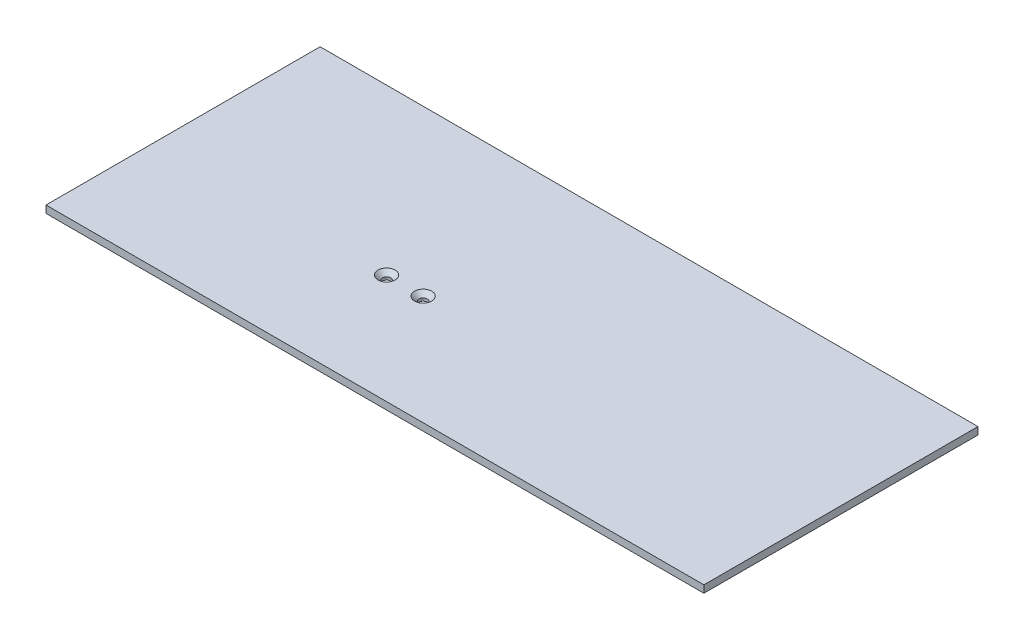
ISO-10303-21;
HEADER;
FILE_DESCRIPTION(('STEP AP214'),'2;1');
FILE_NAME('part.step','',(''),(''),'','','');
FILE_SCHEMA(('AUTOMOTIVE_DESIGN { 1 0 10303 214 1 1 1 1 }'));
ENDSEC;
DATA;
#1=APPLICATION_CONTEXT('core data for automotive mechanical design processes');
#2=APPLICATION_PROTOCOL_DEFINITION('international standard','automotive_design',2000,#1);
#3=PRODUCT_CONTEXT('',#1,'mechanical');
#4=PRODUCT('Part','Part','',(#3));
#5=PRODUCT_RELATED_PRODUCT_CATEGORY('part','',(#4));
#6=PRODUCT_DEFINITION_FORMATION('','',#4);
#7=PRODUCT_DEFINITION_CONTEXT('part definition',#1,'design');
#8=PRODUCT_DEFINITION('design','',#6,#7);
#9=PRODUCT_DEFINITION_SHAPE('','',#8);
#10=(LENGTH_UNIT() NAMED_UNIT(*) SI_UNIT(.MILLI.,.METRE.));
#11=(NAMED_UNIT(*) PLANE_ANGLE_UNIT() SI_UNIT($,.RADIAN.));
#12=(NAMED_UNIT(*) SI_UNIT($,.STERADIAN.) SOLID_ANGLE_UNIT());
#13=UNCERTAINTY_MEASURE_WITH_UNIT(LENGTH_MEASURE(1.E-05),#10,'distance_accuracy_value','');
#14=(GEOMETRIC_REPRESENTATION_CONTEXT(3) GLOBAL_UNCERTAINTY_ASSIGNED_CONTEXT((#13)) GLOBAL_UNIT_ASSIGNED_CONTEXT((#10,
#11,#12)) REPRESENTATION_CONTEXT('',''));
#15=CARTESIAN_POINT('',(0.,0.,0.));
#16=DIRECTION('',(0.,0.,1.));
#17=DIRECTION('',(1.,0.,0.));
#18=AXIS2_PLACEMENT_3D('',#15,#16,#17);
#19=CARTESIAN_POINT('',(-180.,4.,-105.));
#20=DIRECTION('',(0.,0.,1.));
#21=DIRECTION('',(1.,0.,0.));
#22=AXIS2_PLACEMENT_3D('',#19,#20,#21);
#23=PLANE('',#22);
#24=DIRECTION('',(-1.,0.,0.));
#25=VECTOR('',#24,1.);
#26=CARTESIAN_POINT('',(-180.,0.,-105.));
#27=LINE('',#26,#25);
#28=CARTESIAN_POINT('',(180.,0.,-105.));
#29=VERTEX_POINT('',#28);
#30=CARTESIAN_POINT('',(-180.,0.,-105.));
#31=VERTEX_POINT('',#30);
#32=EDGE_CURVE('E88',#29,#31,#27,.T.);
#33=ORIENTED_EDGE('',*,*,#32,.T.);
#34=DIRECTION('',(0.,-1.,0.));
#35=VECTOR('',#34,1.);
#36=CARTESIAN_POINT('',(-180.,4.,-105.));
#37=LINE('',#36,#35);
#38=CARTESIAN_POINT('',(-180.,4.,-105.));
#39=VERTEX_POINT('',#38);
#40=EDGE_CURVE('E42',#39,#31,#37,.T.);
#41=ORIENTED_EDGE('',*,*,#40,.F.);
#42=DIRECTION('',(-1.,0.,0.));
#43=VECTOR('',#42,1.);
#44=CARTESIAN_POINT('',(-180.,4.,-105.));
#45=LINE('',#44,#43);
#46=CARTESIAN_POINT('',(180.,4.,-105.));
#47=VERTEX_POINT('',#46);
#48=EDGE_CURVE('E80',#47,#39,#45,.T.);
#49=ORIENTED_EDGE('',*,*,#48,.F.);
#50=DIRECTION('',(0.,-1.,0.));
#51=VECTOR('',#50,1.);
#52=CARTESIAN_POINT('',(180.,4.,-105.));
#53=LINE('',#52,#51);
#54=EDGE_CURVE('E11',#47,#29,#53,.T.);
#55=ORIENTED_EDGE('',*,*,#54,.T.);
#56=EDGE_LOOP('',(#33,#41,#49,#55));
#57=FACE_BOUND('',#56,.T.);
#58=ADVANCED_FACE('F34',(#57),#23,.F.);
#59=CARTESIAN_POINT('',(-180.,4.,45.));
#60=DIRECTION('',(1.,0.,0.));
#61=DIRECTION('',(0.,0.,-1.));
#62=AXIS2_PLACEMENT_3D('',#59,#60,#61);
#63=PLANE('',#62);
#64=DIRECTION('',(0.,0.,1.));
#65=VECTOR('',#64,1.);
#66=CARTESIAN_POINT('',(-180.,0.,45.));
#67=LINE('',#66,#65);
#68=CARTESIAN_POINT('',(-180.,0.,45.));
#69=VERTEX_POINT('',#68);
#70=EDGE_CURVE('E67',#31,#69,#67,.T.);
#71=ORIENTED_EDGE('',*,*,#70,.T.);
#72=DIRECTION('',(0.,-1.,0.));
#73=VECTOR('',#72,1.);
#74=CARTESIAN_POINT('',(-180.,4.,45.));
#75=LINE('',#74,#73);
#76=CARTESIAN_POINT('',(-180.,4.,45.));
#77=VERTEX_POINT('',#76);
#78=EDGE_CURVE('E89',#77,#69,#75,.T.);
#79=ORIENTED_EDGE('',*,*,#78,.F.);
#80=DIRECTION('',(0.,0.,1.));
#81=VECTOR('',#80,1.);
#82=CARTESIAN_POINT('',(-180.,4.,-45.));
#83=LINE('',#82,#81);
#84=EDGE_CURVE('E84',#39,#77,#83,.T.);
#85=ORIENTED_EDGE('',*,*,#84,.F.);
#86=ORIENTED_EDGE('',*,*,#40,.T.);
#87=EDGE_LOOP('',(#71,#79,#85,#86));
#88=FACE_BOUND('',#87,.T.);
#89=ADVANCED_FACE('F90',(#88),#63,.F.);
#90=CARTESIAN_POINT('',(-180.,4.,45.));
#91=DIRECTION('',(0.,0.,-1.));
#92=DIRECTION('',(-1.,0.,0.));
#93=AXIS2_PLACEMENT_3D('',#90,#91,#92);
#94=PLANE('',#93);
#95=DIRECTION('',(1.,0.,0.));
#96=VECTOR('',#95,1.);
#97=CARTESIAN_POINT('',(-180.,0.,45.));
#98=LINE('',#97,#96);
#99=CARTESIAN_POINT('',(180.,0.,45.));
#100=VERTEX_POINT('',#99);
#101=EDGE_CURVE('E74',#69,#100,#98,.T.);
#102=ORIENTED_EDGE('',*,*,#101,.T.);
#103=DIRECTION('',(0.,-1.,0.));
#104=VECTOR('',#103,1.);
#105=CARTESIAN_POINT('',(180.,4.,45.));
#106=LINE('',#105,#104);
#107=CARTESIAN_POINT('',(180.,4.,45.));
#108=VERTEX_POINT('',#107);
#109=EDGE_CURVE('E94',#108,#100,#106,.T.);
#110=ORIENTED_EDGE('',*,*,#109,.F.);
#111=DIRECTION('',(1.,0.,0.));
#112=VECTOR('',#111,1.);
#113=CARTESIAN_POINT('',(-180.,4.,45.));
#114=LINE('',#113,#112);
#115=EDGE_CURVE('E92',#77,#108,#114,.T.);
#116=ORIENTED_EDGE('',*,*,#115,.F.);
#117=ORIENTED_EDGE('',*,*,#78,.T.);
#118=EDGE_LOOP('',(#102,#110,#116,#117));
#119=FACE_BOUND('',#118,.T.);
#120=ADVANCED_FACE('F105',(#119),#94,.F.);
#121=CARTESIAN_POINT('',(180.,4.,45.));
#122=DIRECTION('',(-1.,0.,0.));
#123=DIRECTION('',(0.,0.,1.));
#124=AXIS2_PLACEMENT_3D('',#121,#122,#123);
#125=PLANE('',#124);
#126=DIRECTION('',(0.,0.,-1.));
#127=VECTOR('',#126,1.);
#128=CARTESIAN_POINT('',(180.,0.,45.));
#129=LINE('',#128,#127);
#130=EDGE_CURVE('E102',#100,#29,#129,.T.);
#131=ORIENTED_EDGE('',*,*,#130,.T.);
#132=ORIENTED_EDGE('',*,*,#54,.F.);
#133=DIRECTION('',(0.,0.,-1.));
#134=VECTOR('',#133,1.);
#135=CARTESIAN_POINT('',(180.,4.,-45.));
#136=LINE('',#135,#134);
#137=EDGE_CURVE('E50',#108,#47,#136,.T.);
#138=ORIENTED_EDGE('',*,*,#137,.F.);
#139=ORIENTED_EDGE('',*,*,#109,.T.);
#140=EDGE_LOOP('',(#131,#132,#138,#139));
#141=FACE_BOUND('',#140,.T.);
#142=ADVANCED_FACE('F109',(#141),#125,.F.);
#143=CARTESIAN_POINT('',(0.,4.,0.));
#144=DIRECTION('',(0.,-1.,0.));
#145=DIRECTION('',(0.,0.,-1.));
#146=AXIS2_PLACEMENT_3D('',#143,#144,#145);
#147=PLANE('',#146);
#148=CARTESIAN_POINT('',(-53.634798041379,4.,-15.));
#149=DIRECTION('',(0.,1.,0.));
#150=DIRECTION('',(0.,0.,1.));
#151=AXIS2_PLACEMENT_3D('',#148,#149,#150);
#152=CIRCLE('',#151,4.7);
#153=CARTESIAN_POINT('',(-53.634798041379,4.,-10.3));
#154=VERTEX_POINT('',#153);
#155=EDGE_CURVE('E199',#154,#154,#152,.T.);
#156=ORIENTED_EDGE('',*,*,#155,.F.);
#157=EDGE_LOOP('',(#156));
#158=FACE_BOUND('',#157,.T.);
#159=CARTESIAN_POINT('',(-33.634798041379,4.,-15.));
#160=DIRECTION('',(0.,1.,0.));
#161=DIRECTION('',(0.,0.,1.));
#162=AXIS2_PLACEMENT_3D('',#159,#160,#161);
#163=CIRCLE('',#162,4.7);
#164=CARTESIAN_POINT('',(-33.634798041379,4.,-10.3));
#165=VERTEX_POINT('',#164);
#166=EDGE_CURVE('E206',#165,#165,#163,.T.);
#167=ORIENTED_EDGE('',*,*,#166,.F.);
#168=EDGE_LOOP('',(#167));
#169=FACE_BOUND('',#168,.T.);
#170=ORIENTED_EDGE('',*,*,#137,.T.);
#171=ORIENTED_EDGE('',*,*,#48,.T.);
#172=ORIENTED_EDGE('',*,*,#84,.T.);
#173=ORIENTED_EDGE('',*,*,#115,.T.);
#174=EDGE_LOOP('',(#170,#171,#172,#173));
#175=FACE_BOUND('',#174,.T.);
#176=ADVANCED_FACE('F82',(#158,#169,#175),#147,.F.);
#177=CARTESIAN_POINT('',(0.,0.,0.));
#178=DIRECTION('',(0.,-1.,0.));
#179=DIRECTION('',(0.,0.,-1.));
#180=AXIS2_PLACEMENT_3D('',#177,#178,#179);
#181=PLANE('',#180);
#182=CARTESIAN_POINT('',(-53.634798041379,0.,-15.));
#183=DIRECTION('',(0.,1.,0.));
#184=DIRECTION('',(0.,0.,1.));
#185=AXIS2_PLACEMENT_3D('',#182,#183,#184);
#186=CIRCLE('',#185,2.25);
#187=CARTESIAN_POINT('',(-53.634798041379,0.,-12.75));
#188=VERTEX_POINT('',#187);
#189=EDGE_CURVE('E201',#188,#188,#186,.T.);
#190=ORIENTED_EDGE('',*,*,#189,.T.);
#191=EDGE_LOOP('',(#190));
#192=FACE_BOUND('',#191,.T.);
#193=CARTESIAN_POINT('',(-33.634798041379,0.,-15.));
#194=DIRECTION('',(0.,1.,0.));
#195=DIRECTION('',(0.,0.,1.));
#196=AXIS2_PLACEMENT_3D('',#193,#194,#195);
#197=CIRCLE('',#196,2.25);
#198=CARTESIAN_POINT('',(-33.634798041379,0.,-12.75));
#199=VERTEX_POINT('',#198);
#200=EDGE_CURVE('E99',#199,#199,#197,.T.);
#201=ORIENTED_EDGE('',*,*,#200,.T.);
#202=EDGE_LOOP('',(#201));
#203=FACE_BOUND('',#202,.T.);
#204=ORIENTED_EDGE('',*,*,#32,.F.);
#205=ORIENTED_EDGE('',*,*,#130,.F.);
#206=ORIENTED_EDGE('',*,*,#101,.F.);
#207=ORIENTED_EDGE('',*,*,#70,.F.);
#208=EDGE_LOOP('',(#204,#205,#206,#207));
#209=FACE_BOUND('',#208,.T.);
#210=ADVANCED_FACE('F108',(#192,#203,#209),#181,.T.);
#211=CARTESIAN_POINT('',(-33.634798041379,4.,-15.));
#212=DIRECTION('',(0.,1.,0.));
#213=DIRECTION('',(0.,0.,1.));
#214=AXIS2_PLACEMENT_3D('',#211,#212,#213);
#215=CYLINDRICAL_SURFACE('',#214,2.25);
#216=ORIENTED_EDGE('',*,*,#200,.F.);
#217=EDGE_LOOP('',(#216));
#218=FACE_BOUND('',#217,.T.);
#219=CARTESIAN_POINT('',(-33.634798041379,1.55,-15.));
#220=DIRECTION('',(0.,1.,0.));
#221=DIRECTION('',(0.,0.,1.));
#222=AXIS2_PLACEMENT_3D('',#219,#220,#221);
#223=CIRCLE('',#222,2.25);
#224=CARTESIAN_POINT('',(-33.634798041379,1.55,-12.75));
#225=VERTEX_POINT('',#224);
#226=EDGE_CURVE('E209',#225,#225,#223,.T.);
#227=ORIENTED_EDGE('',*,*,#226,.T.);
#228=EDGE_LOOP('',(#227));
#229=FACE_BOUND('',#228,.T.);
#230=ADVANCED_FACE('F150',(#218,#229),#215,.F.);
#231=CARTESIAN_POINT('',(-33.634798041379,4.,-15.));
#232=DIRECTION('',(0.,1.,0.));
#233=DIRECTION('',(0.,0.,1.));
#234=AXIS2_PLACEMENT_3D('',#231,#232,#233);
#235=CONICAL_SURFACE('',#234,4.7,0.785398163397447);
#236=ORIENTED_EDGE('',*,*,#226,.F.);
#237=EDGE_LOOP('',(#236));
#238=FACE_BOUND('',#237,.T.);
#239=ORIENTED_EDGE('',*,*,#166,.T.);
#240=EDGE_LOOP('',(#239));
#241=FACE_BOUND('',#240,.T.);
#242=ADVANCED_FACE('F159',(#238,#241),#235,.F.);
#243=CARTESIAN_POINT('',(-53.634798041379,4.,-15.));
#244=DIRECTION('',(0.,1.,0.));
#245=DIRECTION('',(0.,0.,1.));
#246=AXIS2_PLACEMENT_3D('',#243,#244,#245);
#247=CYLINDRICAL_SURFACE('',#246,2.25);
#248=ORIENTED_EDGE('',*,*,#189,.F.);
#249=EDGE_LOOP('',(#248));
#250=FACE_BOUND('',#249,.T.);
#251=CARTESIAN_POINT('',(-53.634798041379,1.55,-15.));
#252=DIRECTION('',(0.,1.,0.));
#253=DIRECTION('',(0.,0.,1.));
#254=AXIS2_PLACEMENT_3D('',#251,#252,#253);
#255=CIRCLE('',#254,2.25);
#256=CARTESIAN_POINT('',(-53.634798041379,1.55,-12.75));
#257=VERTEX_POINT('',#256);
#258=EDGE_CURVE('E196',#257,#257,#255,.T.);
#259=ORIENTED_EDGE('',*,*,#258,.T.);
#260=EDGE_LOOP('',(#259));
#261=FACE_BOUND('',#260,.T.);
#262=ADVANCED_FACE('F169',(#250,#261),#247,.F.);
#263=CARTESIAN_POINT('',(-53.634798041379,4.,-15.));
#264=DIRECTION('',(0.,1.,0.));
#265=DIRECTION('',(0.,0.,1.));
#266=AXIS2_PLACEMENT_3D('',#263,#264,#265);
#267=CONICAL_SURFACE('',#266,4.7,0.785398163397448);
#268=ORIENTED_EDGE('',*,*,#258,.F.);
#269=EDGE_LOOP('',(#268));
#270=FACE_BOUND('',#269,.T.);
#271=ORIENTED_EDGE('',*,*,#155,.T.);
#272=EDGE_LOOP('',(#271));
#273=FACE_BOUND('',#272,.T.);
#274=ADVANCED_FACE('F179',(#270,#273),#267,.F.);
#275=CLOSED_SHELL('',(#58,#89,#120,#142,#176,#210,#230,#242,#262,#274));
#276=MANIFOLD_SOLID_BREP('B2',#275);
#277=ADVANCED_BREP_SHAPE_REPRESENTATION('',(#18,#276),#14);
#278=SHAPE_DEFINITION_REPRESENTATION(#9,#277);
ENDSEC;
END-ISO-10303-21;
